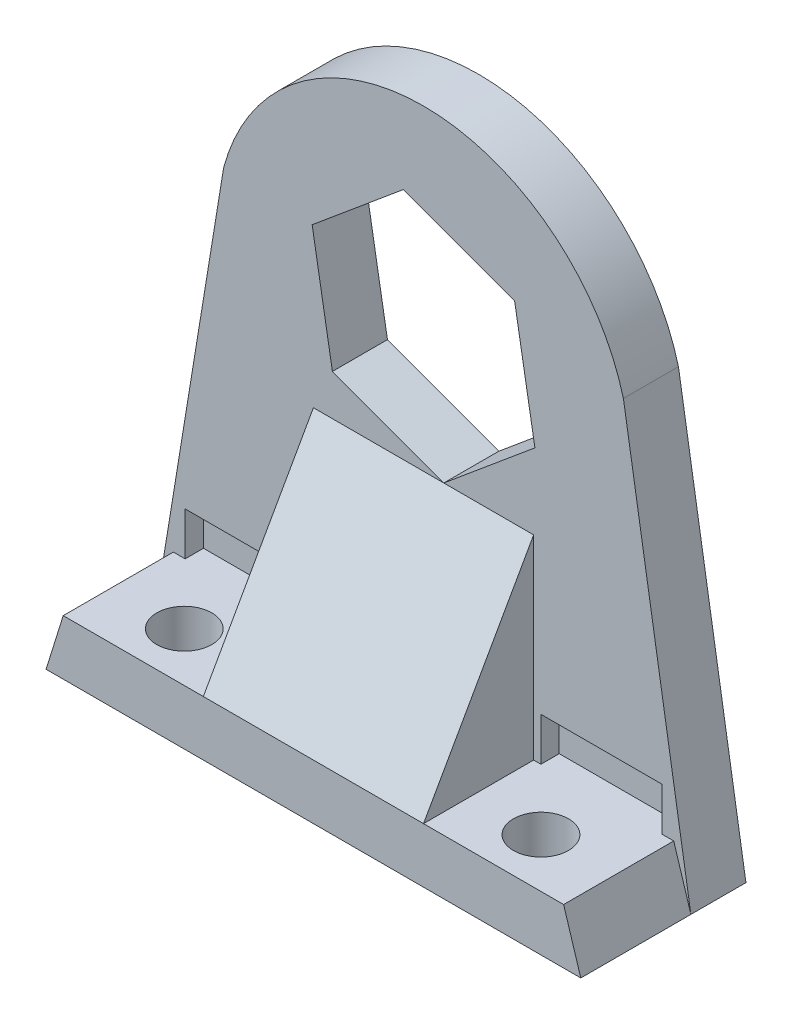
ISO-10303-21;
HEADER;
FILE_DESCRIPTION(('STEP AP214'),'2;1');
FILE_NAME('part.step','',(''),(''),'','','');
FILE_SCHEMA(('AUTOMOTIVE_DESIGN { 1 0 10303 214 1 1 1 1 }'));
ENDSEC;
DATA;
#1=APPLICATION_CONTEXT('core data for automotive mechanical design processes');
#2=APPLICATION_PROTOCOL_DEFINITION('international standard','automotive_design',2000,#1);
#3=PRODUCT_CONTEXT('',#1,'mechanical');
#4=PRODUCT('Part','Part','',(#3));
#5=PRODUCT_RELATED_PRODUCT_CATEGORY('part','',(#4));
#6=PRODUCT_DEFINITION_FORMATION('','',#4);
#7=PRODUCT_DEFINITION_CONTEXT('part definition',#1,'design');
#8=PRODUCT_DEFINITION('design','',#6,#7);
#9=PRODUCT_DEFINITION_SHAPE('','',#8);
#10=(LENGTH_UNIT() NAMED_UNIT(*) SI_UNIT(.MILLI.,.METRE.));
#11=(NAMED_UNIT(*) PLANE_ANGLE_UNIT() SI_UNIT($,.RADIAN.));
#12=(NAMED_UNIT(*) SI_UNIT($,.STERADIAN.) SOLID_ANGLE_UNIT());
#13=UNCERTAINTY_MEASURE_WITH_UNIT(LENGTH_MEASURE(1.E-05),#10,'distance_accuracy_value','');
#14=(GEOMETRIC_REPRESENTATION_CONTEXT(3) GLOBAL_UNCERTAINTY_ASSIGNED_CONTEXT((#13)) GLOBAL_UNIT_ASSIGNED_CONTEXT((#10,
#11,#12)) REPRESENTATION_CONTEXT('',''));
#15=CARTESIAN_POINT('',(0.,0.,0.));
#16=DIRECTION('',(0.,0.,1.));
#17=DIRECTION('',(1.,0.,0.));
#18=AXIS2_PLACEMENT_3D('',#15,#16,#17);
#19=CARTESIAN_POINT('',(0.,-8.15,9.));
#20=DIRECTION('',(0.,-1.,0.));
#21=DIRECTION('',(0.,0.,-1.));
#22=AXIS2_PLACEMENT_3D('',#19,#20,#21);
#23=PLANE('',#22);
#24=CARTESIAN_POINT('',(-9.71863902459822,-8.15,6.31932922540484));
#25=DIRECTION('',(0.,1.,0.));
#26=DIRECTION('',(0.,0.,1.));
#27=AXIS2_PLACEMENT_3D('',#24,#25,#26);
#28=CIRCLE('',#27,1.5);
#29=CARTESIAN_POINT('',(-9.71863902459822,-8.15,7.81932922540484));
#30=VERTEX_POINT('',#29);
#31=EDGE_CURVE('E373',#30,#30,#28,.T.);
#32=ORIENTED_EDGE('',*,*,#31,.F.);
#33=EDGE_LOOP('',(#32));
#34=FACE_BOUND('',#33,.T.);
#35=DIRECTION('',(0.,0.,-1.));
#36=VECTOR('',#35,1.);
#37=CARTESIAN_POINT('',(-6.,-8.15,3.));
#38=LINE('',#37,#36);
#39=CARTESIAN_POINT('',(-6.,-8.15,9.));
#40=VERTEX_POINT('',#39);
#41=CARTESIAN_POINT('',(-6.,-8.15,3.));
#42=VERTEX_POINT('',#41);
#43=EDGE_CURVE('E261',#40,#42,#38,.T.);
#44=ORIENTED_EDGE('',*,*,#43,.T.);
#45=DIRECTION('',(-1.,0.,0.));
#46=VECTOR('',#45,1.);
#47=CARTESIAN_POINT('',(0.,-8.15,3.));
#48=LINE('',#47,#46);
#49=CARTESIAN_POINT('',(-6.39519606206425,-8.15,3.));
#50=VERTEX_POINT('',#49);
#51=EDGE_CURVE('E396',#42,#50,#48,.T.);
#52=ORIENTED_EDGE('',*,*,#51,.T.);
#53=DIRECTION('',(0.,0.,1.));
#54=VECTOR('',#53,1.);
#55=CARTESIAN_POINT('',(-6.39519606206425,-8.15,2.));
#56=LINE('',#55,#54);
#57=CARTESIAN_POINT('',(-6.39519606206425,-8.15,2.));
#58=VERTEX_POINT('',#57);
#59=EDGE_CURVE('E264',#58,#50,#56,.T.);
#60=ORIENTED_EDGE('',*,*,#59,.F.);
#61=DIRECTION('',(1.,0.,0.));
#62=VECTOR('',#61,1.);
#63=CARTESIAN_POINT('',(-12.991498918533,-8.15,2.));
#64=LINE('',#63,#62);
#65=CARTESIAN_POINT('',(-12.991498918533,-8.15,2.));
#66=VERTEX_POINT('',#65);
#67=EDGE_CURVE('E242',#66,#58,#64,.T.);
#68=ORIENTED_EDGE('',*,*,#67,.F.);
#69=DIRECTION('',(0.,0.,1.));
#70=VECTOR('',#69,1.);
#71=CARTESIAN_POINT('',(-12.991498918533,-8.15,2.));
#72=LINE('',#71,#70);
#73=CARTESIAN_POINT('',(-12.991498918533,-8.15,3.));
#74=VERTEX_POINT('',#73);
#75=EDGE_CURVE('E252',#66,#74,#72,.T.);
#76=ORIENTED_EDGE('',*,*,#75,.T.);
#77=CARTESIAN_POINT('',(-13.6342789095463,-8.15,3.));
#78=VERTEX_POINT('',#77);
#79=EDGE_CURVE('E379',#74,#78,#48,.T.);
#80=ORIENTED_EDGE('',*,*,#79,.T.);
#81=DIRECTION('',(0.,0.,-1.));
#82=VECTOR('',#81,1.);
#83=CARTESIAN_POINT('',(-13.6342789095463,-8.15,9.));
#84=LINE('',#83,#82);
#85=CARTESIAN_POINT('',(-13.6342789095463,-8.15,9.));
#86=VERTEX_POINT('',#85);
#87=EDGE_CURVE('E398',#86,#78,#84,.T.);
#88=ORIENTED_EDGE('',*,*,#87,.F.);
#89=DIRECTION('',(-1.,0.,0.));
#90=VECTOR('',#89,1.);
#91=CARTESIAN_POINT('',(-13.6342789095463,-8.15,9.));
#92=LINE('',#91,#90);
#93=EDGE_CURVE('E384',#40,#86,#92,.T.);
#94=ORIENTED_EDGE('',*,*,#93,.F.);
#95=EDGE_LOOP('',(#44,#52,#60,#68,#76,#80,#88,#94));
#96=FACE_BOUND('',#95,.T.);
#97=ADVANCED_FACE('F38',(#34,#96),#23,.F.);
#98=CARTESIAN_POINT('',(-10.1101622731683,3.15237961251199,3.));
#99=DIRECTION('',(0.954669206131406,-0.297668787185406,0.));
#100=DIRECTION('',(0.297668787185406,0.954669206131406,0.));
#101=AXIS2_PLACEMENT_3D('',#98,#99,#100);
#102=PLANE('',#101);
#103=DIRECTION('',(0.297668787185406,0.954669206131406,0.));
#104=VECTOR('',#103,1.);
#105=CARTESIAN_POINT('',(-10.1101622731683,3.15237961251199,3.));
#106=LINE('',#105,#104);
#107=CARTESIAN_POINT('',(-14.5696881128817,-11.15,3.));
#108=VERTEX_POINT('',#107);
#109=EDGE_CURVE('E364',#108,#78,#106,.T.);
#110=ORIENTED_EDGE('',*,*,#109,.F.);
#111=DIRECTION('',(0.,0.,-1.));
#112=VECTOR('',#111,1.);
#113=CARTESIAN_POINT('',(-14.5696881128817,-11.15,3.));
#114=LINE('',#113,#112);
#115=CARTESIAN_POINT('',(-14.5696881128817,-11.15,9.));
#116=VERTEX_POINT('',#115);
#117=EDGE_CURVE('E11',#116,#108,#114,.T.);
#118=ORIENTED_EDGE('',*,*,#117,.F.);
#119=DIRECTION('',(-0.297668787185405,-0.954669206131407,0.));
#120=VECTOR('',#119,1.);
#121=CARTESIAN_POINT('',(-14.5696881128817,-11.15,9.));
#122=LINE('',#121,#120);
#123=EDGE_CURVE('E383',#86,#116,#122,.T.);
#124=ORIENTED_EDGE('',*,*,#123,.F.);
#125=ORIENTED_EDGE('',*,*,#87,.T.);
#126=EDGE_LOOP('',(#110,#118,#124,#125));
#127=FACE_BOUND('',#126,.T.);
#128=ADVANCED_FACE('F40',(#127),#102,.F.);
#129=CARTESIAN_POINT('',(10.1101622731683,3.152379612512,3.));
#130=DIRECTION('',(0.954669206131406,0.297668787185406,0.));
#131=DIRECTION('',(-0.297668787185406,0.954669206131406,0.));
#132=AXIS2_PLACEMENT_3D('',#129,#130,#131);
#133=PLANE('',#132);
#134=DIRECTION('',(0.,0.,-1.));
#135=VECTOR('',#134,1.);
#136=CARTESIAN_POINT('',(14.5696881128817,-11.15,3.));
#137=LINE('',#136,#135);
#138=CARTESIAN_POINT('',(14.5696881128817,-11.15,9.));
#139=VERTEX_POINT('',#138);
#140=CARTESIAN_POINT('',(14.5696881128817,-11.15,3.));
#141=VERTEX_POINT('',#140);
#142=EDGE_CURVE('E46',#139,#141,#137,.T.);
#143=ORIENTED_EDGE('',*,*,#142,.T.);
#144=DIRECTION('',(-0.297668787185406,0.954669206131406,0.));
#145=VECTOR('',#144,1.);
#146=CARTESIAN_POINT('',(10.1101622731683,3.152379612512,3.));
#147=LINE('',#146,#145);
#148=CARTESIAN_POINT('',(13.6342789095463,-8.15,3.));
#149=VERTEX_POINT('',#148);
#150=EDGE_CURVE('E357',#141,#149,#147,.T.);
#151=ORIENTED_EDGE('',*,*,#150,.T.);
#152=DIRECTION('',(0.,0.,-1.));
#153=VECTOR('',#152,1.);
#154=CARTESIAN_POINT('',(13.6342789095463,-8.15,9.));
#155=LINE('',#154,#153);
#156=CARTESIAN_POINT('',(13.6342789095463,-8.15,9.));
#157=VERTEX_POINT('',#156);
#158=EDGE_CURVE('E393',#157,#149,#155,.T.);
#159=ORIENTED_EDGE('',*,*,#158,.F.);
#160=DIRECTION('',(-0.297668787185406,0.954669206131406,0.));
#161=VECTOR('',#160,1.);
#162=CARTESIAN_POINT('',(13.6342789095463,-8.15,9.));
#163=LINE('',#162,#161);
#164=EDGE_CURVE('E390',#139,#157,#163,.T.);
#165=ORIENTED_EDGE('',*,*,#164,.F.);
#166=EDGE_LOOP('',(#143,#151,#159,#165));
#167=FACE_BOUND('',#166,.T.);
#168=ADVANCED_FACE('F406',(#167),#133,.T.);
#169=CARTESIAN_POINT('',(0.,-11.15,3.));
#170=DIRECTION('',(0.,1.,0.));
#171=DIRECTION('',(-1.,0.,0.));
#172=AXIS2_PLACEMENT_3D('',#169,#170,#171);
#173=PLANE('',#172);
#174=DIRECTION('',(0.,0.,-1.));
#175=VECTOR('',#174,1.);
#176=CARTESIAN_POINT('',(14.5696881128817,-11.15,3.));
#177=LINE('',#176,#175);
#178=CARTESIAN_POINT('',(14.5696881128817,-11.15,0.));
#179=VERTEX_POINT('',#178);
#180=EDGE_CURVE('E354',#141,#179,#177,.T.);
#181=ORIENTED_EDGE('',*,*,#180,.F.);
#182=ORIENTED_EDGE('',*,*,#142,.F.);
#183=DIRECTION('',(1.,0.,0.));
#184=VECTOR('',#183,1.);
#185=CARTESIAN_POINT('',(14.5696881128817,-11.15,9.));
#186=LINE('',#185,#184);
#187=EDGE_CURVE('E387',#116,#139,#186,.T.);
#188=ORIENTED_EDGE('',*,*,#187,.F.);
#189=ORIENTED_EDGE('',*,*,#117,.T.);
#190=DIRECTION('',(0.,0.,-1.));
#191=VECTOR('',#190,1.);
#192=CARTESIAN_POINT('',(-14.5696881128817,-11.15,3.));
#193=LINE('',#192,#191);
#194=CARTESIAN_POINT('',(-14.5696881128817,-11.15,0.));
#195=VERTEX_POINT('',#194);
#196=EDGE_CURVE('E346',#108,#195,#193,.T.);
#197=ORIENTED_EDGE('',*,*,#196,.T.);
#198=DIRECTION('',(1.,0.,0.));
#199=VECTOR('',#198,1.);
#200=CARTESIAN_POINT('',(0.,-11.15,0.));
#201=LINE('',#200,#199);
#202=EDGE_CURVE('E401',#195,#179,#201,.T.);
#203=ORIENTED_EDGE('',*,*,#202,.T.);
#204=EDGE_LOOP('',(#181,#182,#188,#189,#197,#203));
#205=FACE_BOUND('',#204,.T.);
#206=CARTESIAN_POINT('',(-9.71863902459822,-11.15,6.31932922540484));
#207=DIRECTION('',(0.,1.,0.));
#208=DIRECTION('',(-1.,0.,0.));
#209=AXIS2_PLACEMENT_3D('',#206,#207,#208);
#210=CIRCLE('',#209,1.5);
#211=CARTESIAN_POINT('',(-11.2186390245982,-11.15,6.31932922540484));
#212=VERTEX_POINT('',#211);
#213=EDGE_CURVE('E376',#212,#212,#210,.T.);
#214=ORIENTED_EDGE('',*,*,#213,.T.);
#215=EDGE_LOOP('',(#214));
#216=FACE_BOUND('',#215,.T.);
#217=CARTESIAN_POINT('',(9.71863902459822,-11.15,6.31932922540484));
#218=DIRECTION('',(0.,1.,0.));
#219=DIRECTION('',(-1.,0.,0.));
#220=AXIS2_PLACEMENT_3D('',#217,#218,#219);
#221=CIRCLE('',#220,1.5);
#222=CARTESIAN_POINT('',(8.21863902459822,-11.15,6.31932922540484));
#223=VERTEX_POINT('',#222);
#224=EDGE_CURVE('E370',#223,#223,#221,.T.);
#225=ORIENTED_EDGE('',*,*,#224,.T.);
#226=EDGE_LOOP('',(#225));
#227=FACE_BOUND('',#226,.T.);
#228=ADVANCED_FACE('F427',(#205,#216,#227),#173,.F.);
#229=CARTESIAN_POINT('',(0.,0.,3.));
#230=DIRECTION('',(0.,0.,1.));
#231=DIRECTION('',(1.,0.,0.));
#232=AXIS2_PLACEMENT_3D('',#229,#230,#231);
#233=PLANE('',#232);
#234=DIRECTION('',(0.,-1.,0.));
#235=VECTOR('',#234,1.);
#236=CARTESIAN_POINT('',(6.39519606206425,-8.15,3.));
#237=LINE('',#236,#235);
#238=CARTESIAN_POINT('',(6.39519606206425,-5.79113132266735,3.));
#239=VERTEX_POINT('',#238);
#240=CARTESIAN_POINT('',(6.39519606206425,-8.15,3.));
#241=VERTEX_POINT('',#240);
#242=EDGE_CURVE('E53',#239,#241,#237,.T.);
#243=ORIENTED_EDGE('',*,*,#242,.F.);
#244=DIRECTION('',(-1.,0.,0.));
#245=VECTOR('',#244,1.);
#246=CARTESIAN_POINT('',(12.991498918533,-5.79113132266735,3.));
#247=LINE('',#246,#245);
#248=CARTESIAN_POINT('',(12.991498918533,-5.79113132266735,3.));
#249=VERTEX_POINT('',#248);
#250=EDGE_CURVE('E225',#249,#239,#247,.T.);
#251=ORIENTED_EDGE('',*,*,#250,.F.);
#252=DIRECTION('',(0.,1.,0.));
#253=VECTOR('',#252,1.);
#254=CARTESIAN_POINT('',(12.991498918533,-8.15,3.));
#255=LINE('',#254,#253);
#256=CARTESIAN_POINT('',(12.991498918533,-8.15,3.));
#257=VERTEX_POINT('',#256);
#258=EDGE_CURVE('E230',#257,#249,#255,.T.);
#259=ORIENTED_EDGE('',*,*,#258,.F.);
#260=EDGE_CURVE('E207',#149,#257,#48,.T.);
#261=ORIENTED_EDGE('',*,*,#260,.F.);
#262=ORIENTED_EDGE('',*,*,#150,.F.);
#263=DIRECTION('',(-0.161194639212652,0.986922635412271,0.));
#264=VECTOR('',#263,1.);
#265=CARTESIAN_POINT('',(12.4172975219101,2.02812431513877,3.));
#266=LINE('',#265,#264);
#267=CARTESIAN_POINT('',(10.8926184348422,11.3630520156931,3.));
#268=VERTEX_POINT('',#267);
#269=EDGE_CURVE('E344',#141,#268,#266,.T.);
#270=ORIENTED_EDGE('',*,*,#269,.T.);
#271=CARTESIAN_POINT('',(0.,8.44085626281097,3.));
#272=DIRECTION('',(0.,0.,-1.));
#273=DIRECTION('',(-1.,0.,0.));
#274=AXIS2_PLACEMENT_3D('',#271,#272,#273);
#275=CIRCLE('',#274,11.2777818911889);
#276=CARTESIAN_POINT('',(-10.8926184348422,11.3630520156931,3.));
#277=VERTEX_POINT('',#276);
#278=EDGE_CURVE('E340',#277,#268,#275,.T.);
#279=ORIENTED_EDGE('',*,*,#278,.F.);
#280=DIRECTION('',(0.161194639212651,0.986922635412272,0.));
#281=VECTOR('',#280,1.);
#282=CARTESIAN_POINT('',(-12.4172975219102,2.02812431513876,3.));
#283=LINE('',#282,#281);
#284=EDGE_CURVE('E337',#108,#277,#283,.T.);
#285=ORIENTED_EDGE('',*,*,#284,.F.);
#286=ORIENTED_EDGE('',*,*,#109,.T.);
#287=ORIENTED_EDGE('',*,*,#79,.F.);
#288=DIRECTION('',(0.,-1.,0.));
#289=VECTOR('',#288,1.);
#290=CARTESIAN_POINT('',(-12.991498918533,-8.15,3.));
#291=LINE('',#290,#289);
#292=CARTESIAN_POINT('',(-12.991498918533,-5.79113132266735,3.));
#293=VERTEX_POINT('',#292);
#294=EDGE_CURVE('E61',#293,#74,#291,.T.);
#295=ORIENTED_EDGE('',*,*,#294,.F.);
#296=DIRECTION('',(-1.,0.,0.));
#297=VECTOR('',#296,1.);
#298=CARTESIAN_POINT('',(-12.991498918533,-5.79113132266735,3.));
#299=LINE('',#298,#297);
#300=CARTESIAN_POINT('',(-6.39519606206425,-5.79113132266735,3.));
#301=VERTEX_POINT('',#300);
#302=EDGE_CURVE('E243',#301,#293,#299,.T.);
#303=ORIENTED_EDGE('',*,*,#302,.F.);
#304=DIRECTION('',(0.,1.,0.));
#305=VECTOR('',#304,1.);
#306=CARTESIAN_POINT('',(-6.39519606206425,-8.15,3.));
#307=LINE('',#306,#305);
#308=EDGE_CURVE('E254',#50,#301,#307,.T.);
#309=ORIENTED_EDGE('',*,*,#308,.F.);
#310=ORIENTED_EDGE('',*,*,#51,.F.);
#311=DIRECTION('',(0.,1.,0.));
#312=VECTOR('',#311,1.);
#313=CARTESIAN_POINT('',(-6.,2.47853475664068,3.));
#314=LINE('',#313,#312);
#315=CARTESIAN_POINT('',(-6.,2.47853475664068,3.));
#316=VERTEX_POINT('',#315);
#317=EDGE_CURVE('E278',#42,#316,#314,.T.);
#318=ORIENTED_EDGE('',*,*,#317,.T.);
#319=DIRECTION('',(-1.,0.,0.));
#320=VECTOR('',#319,1.);
#321=CARTESIAN_POINT('',(6.,2.47853475664068,3.));
#322=LINE('',#321,#320);
#323=CARTESIAN_POINT('',(1.103523441526,2.47853475664068,3.));
#324=VERTEX_POINT('',#323);
#325=EDGE_CURVE('E285',#324,#316,#322,.T.);
#326=ORIENTED_EDGE('',*,*,#325,.F.);
#327=DIRECTION('',(-0.938649749917155,0.344871928374087,0.));
#328=VECTOR('',#327,1.);
#329=CARTESIAN_POINT('',(1.103523441526,2.47853475664068,3.));
#330=LINE('',#329,#328);
#331=CARTESIAN_POINT('',(-4.96608903931578,4.7085880442872,3.));
#332=VERTEX_POINT('',#331);
#333=EDGE_CURVE('E302',#324,#332,#330,.T.);
#334=ORIENTED_EDGE('',*,*,#333,.T.);
#335=DIRECTION('',(-0.17065702393449,0.985330492871211,0.));
#336=VECTOR('',#335,1.);
#337=CARTESIAN_POINT('',(-4.96608903931578,4.7085880442872,3.));
#338=LINE('',#337,#336);
#339=CARTESIAN_POINT('',(-6.06961248084178,11.0800532876465,3.));
#340=VERTEX_POINT('',#339);
#341=EDGE_CURVE('E305',#332,#340,#338,.T.);
#342=ORIENTED_EDGE('',*,*,#341,.T.);
#343=DIRECTION('',(0.767992725982665,0.640458564497123,0.));
#344=VECTOR('',#343,1.);
#345=CARTESIAN_POINT('',(-6.06961248084178,11.0800532876465,3.));
#346=LINE('',#345,#344);
#347=CARTESIAN_POINT('',(-1.103523441526,15.2214652433593,3.));
#348=VERTEX_POINT('',#347);
#349=EDGE_CURVE('E289',#340,#348,#346,.T.);
#350=ORIENTED_EDGE('',*,*,#349,.T.);
#351=DIRECTION('',(0.938649749917155,-0.344871928374087,0.));
#352=VECTOR('',#351,1.);
#353=CARTESIAN_POINT('',(-1.103523441526,15.2214652433593,3.));
#354=LINE('',#353,#352);
#355=CARTESIAN_POINT('',(4.96608903931578,12.9914119557128,3.));
#356=VERTEX_POINT('',#355);
#357=EDGE_CURVE('E292',#348,#356,#354,.T.);
#358=ORIENTED_EDGE('',*,*,#357,.T.);
#359=DIRECTION('',(0.17065702393449,-0.985330492871211,0.));
#360=VECTOR('',#359,1.);
#361=CARTESIAN_POINT('',(4.96608903931578,12.9914119557128,3.));
#362=LINE('',#361,#360);
#363=CARTESIAN_POINT('',(6.06961248084178,6.61994671235349,3.));
#364=VERTEX_POINT('',#363);
#365=EDGE_CURVE('E296',#356,#364,#362,.T.);
#366=ORIENTED_EDGE('',*,*,#365,.T.);
#367=DIRECTION('',(-0.767992725982665,-0.640458564497123,0.));
#368=VECTOR('',#367,1.);
#369=CARTESIAN_POINT('',(6.06961248084178,6.61994671235349,3.));
#370=LINE('',#369,#368);
#371=EDGE_CURVE('E299',#364,#324,#370,.T.);
#372=ORIENTED_EDGE('',*,*,#371,.T.);
#373=CARTESIAN_POINT('',(6.,2.47853475664068,3.));
#374=VERTEX_POINT('',#373);
#375=EDGE_CURVE('E286',#374,#324,#322,.T.);
#376=ORIENTED_EDGE('',*,*,#375,.F.);
#377=DIRECTION('',(0.,1.,0.));
#378=VECTOR('',#377,1.);
#379=CARTESIAN_POINT('',(6.,2.47853475664068,3.));
#380=LINE('',#379,#378);
#381=CARTESIAN_POINT('',(6.,-8.15,3.));
#382=VERTEX_POINT('',#381);
#383=EDGE_CURVE('E270',#382,#374,#380,.T.);
#384=ORIENTED_EDGE('',*,*,#383,.F.);
#385=EDGE_CURVE('E395',#241,#382,#48,.T.);
#386=ORIENTED_EDGE('',*,*,#385,.F.);
#387=EDGE_LOOP('',(#243,#251,#259,#261,#262,#270,#279,#285,#286,#287,#295,#303,#309,#310,#318,
#326,#334,#342,#350,#358,#366,#372,#376,#384,#386));
#388=FACE_BOUND('',#387,.T.);
#389=ADVANCED_FACE('F412',(#388),#233,.T.);
#390=CARTESIAN_POINT('',(0.,0.,0.));
#391=DIRECTION('',(0.,0.,1.));
#392=DIRECTION('',(1.,0.,0.));
#393=AXIS2_PLACEMENT_3D('',#390,#391,#392);
#394=PLANE('',#393);
#395=DIRECTION('',(0.938649749917155,-0.344871928374087,0.));
#396=VECTOR('',#395,1.);
#397=CARTESIAN_POINT('',(-1.103523441526,15.2214652433593,0.));
#398=LINE('',#397,#396);
#399=CARTESIAN_POINT('',(-1.103523441526,15.2214652433593,0.));
#400=VERTEX_POINT('',#399);
#401=CARTESIAN_POINT('',(4.96608903931578,12.9914119557128,0.));
#402=VERTEX_POINT('',#401);
#403=EDGE_CURVE('E310',#400,#402,#398,.T.);
#404=ORIENTED_EDGE('',*,*,#403,.F.);
#405=DIRECTION('',(0.767992725982665,0.640458564497123,0.));
#406=VECTOR('',#405,1.);
#407=CARTESIAN_POINT('',(-6.06961248084178,11.0800532876465,0.));
#408=LINE('',#407,#406);
#409=CARTESIAN_POINT('',(-6.06961248084178,11.0800532876465,0.));
#410=VERTEX_POINT('',#409);
#411=EDGE_CURVE('E288',#410,#400,#408,.T.);
#412=ORIENTED_EDGE('',*,*,#411,.F.);
#413=DIRECTION('',(-0.17065702393449,0.985330492871211,0.));
#414=VECTOR('',#413,1.);
#415=CARTESIAN_POINT('',(-4.96608903931578,4.7085880442872,0.));
#416=LINE('',#415,#414);
#417=CARTESIAN_POINT('',(-4.96608903931578,4.7085880442872,0.));
#418=VERTEX_POINT('',#417);
#419=EDGE_CURVE('E293',#418,#410,#416,.T.);
#420=ORIENTED_EDGE('',*,*,#419,.F.);
#421=DIRECTION('',(-0.938649749917155,0.344871928374087,0.));
#422=VECTOR('',#421,1.);
#423=CARTESIAN_POINT('',(1.103523441526,2.47853475664068,0.));
#424=LINE('',#423,#422);
#425=CARTESIAN_POINT('',(1.103523441526,2.47853475664068,0.));
#426=VERTEX_POINT('',#425);
#427=EDGE_CURVE('E319',#426,#418,#424,.T.);
#428=ORIENTED_EDGE('',*,*,#427,.F.);
#429=DIRECTION('',(-0.767992725982665,-0.640458564497123,0.));
#430=VECTOR('',#429,1.);
#431=CARTESIAN_POINT('',(6.06961248084178,6.61994671235349,0.));
#432=LINE('',#431,#430);
#433=CARTESIAN_POINT('',(6.06961248084178,6.61994671235349,0.));
#434=VERTEX_POINT('',#433);
#435=EDGE_CURVE('E316',#434,#426,#432,.T.);
#436=ORIENTED_EDGE('',*,*,#435,.F.);
#437=DIRECTION('',(0.17065702393449,-0.985330492871211,0.));
#438=VECTOR('',#437,1.);
#439=CARTESIAN_POINT('',(4.96608903931578,12.9914119557128,0.));
#440=LINE('',#439,#438);
#441=EDGE_CURVE('E313',#402,#434,#440,.T.);
#442=ORIENTED_EDGE('',*,*,#441,.F.);
#443=EDGE_LOOP('',(#404,#412,#420,#428,#436,#442));
#444=FACE_BOUND('',#443,.T.);
#445=ORIENTED_EDGE('',*,*,#202,.F.);
#446=DIRECTION('',(0.161194639212651,0.986922635412272,0.));
#447=VECTOR('',#446,1.);
#448=CARTESIAN_POINT('',(-12.4172975219102,2.02812431513876,0.));
#449=LINE('',#448,#447);
#450=CARTESIAN_POINT('',(-10.8926184348422,11.3630520156931,0.));
#451=VERTEX_POINT('',#450);
#452=EDGE_CURVE('E326',#195,#451,#449,.T.);
#453=ORIENTED_EDGE('',*,*,#452,.T.);
#454=CARTESIAN_POINT('',(0.,8.44085626281097,0.));
#455=DIRECTION('',(0.,0.,-1.));
#456=DIRECTION('',(-1.,0.,0.));
#457=AXIS2_PLACEMENT_3D('',#454,#455,#456);
#458=CIRCLE('',#457,11.2777818911889);
#459=CARTESIAN_POINT('',(10.8926184348422,11.3630520156931,0.));
#460=VERTEX_POINT('',#459);
#461=EDGE_CURVE('E349',#451,#460,#458,.T.);
#462=ORIENTED_EDGE('',*,*,#461,.T.);
#463=DIRECTION('',(-0.161194639212652,0.986922635412271,0.));
#464=VECTOR('',#463,1.);
#465=CARTESIAN_POINT('',(12.4172975219101,2.02812431513877,0.));
#466=LINE('',#465,#464);
#467=EDGE_CURVE('E341',#179,#460,#466,.T.);
#468=ORIENTED_EDGE('',*,*,#467,.F.);
#469=EDGE_LOOP('',(#445,#453,#462,#468));
#470=FACE_BOUND('',#469,.T.);
#471=ADVANCED_FACE('F430',(#444,#470),#394,.F.);
#472=CARTESIAN_POINT('',(9.71863902459822,-8.15,6.31932922540484));
#473=DIRECTION('',(0.,1.,0.));
#474=DIRECTION('',(0.,0.,-1.));
#475=AXIS2_PLACEMENT_3D('',#472,#473,#474);
#476=CIRCLE('',#475,1.5);
#477=CARTESIAN_POINT('',(9.71863902459822,-8.15,4.81932922540484));
#478=VERTEX_POINT('',#477);
#479=EDGE_CURVE('E367',#478,#478,#476,.T.);
#480=ORIENTED_EDGE('',*,*,#479,.F.);
#481=EDGE_LOOP('',(#480));
#482=FACE_BOUND('',#481,.T.);
#483=ORIENTED_EDGE('',*,*,#260,.T.);
#484=DIRECTION('',(0.,0.,1.));
#485=VECTOR('',#484,1.);
#486=CARTESIAN_POINT('',(12.991498918533,-8.15,2.));
#487=LINE('',#486,#485);
#488=CARTESIAN_POINT('',(12.991498918533,-8.15,2.));
#489=VERTEX_POINT('',#488);
#490=EDGE_CURVE('E199',#489,#257,#487,.T.);
#491=ORIENTED_EDGE('',*,*,#490,.F.);
#492=DIRECTION('',(1.,0.,0.));
#493=VECTOR('',#492,1.);
#494=CARTESIAN_POINT('',(12.991498918533,-8.15,2.));
#495=LINE('',#494,#493);
#496=CARTESIAN_POINT('',(6.39519606206425,-8.15,2.));
#497=VERTEX_POINT('',#496);
#498=EDGE_CURVE('E203',#497,#489,#495,.T.);
#499=ORIENTED_EDGE('',*,*,#498,.F.);
#500=DIRECTION('',(0.,0.,1.));
#501=VECTOR('',#500,1.);
#502=CARTESIAN_POINT('',(6.39519606206425,-8.15,2.));
#503=LINE('',#502,#501);
#504=EDGE_CURVE('E234',#497,#241,#503,.T.);
#505=ORIENTED_EDGE('',*,*,#504,.T.);
#506=ORIENTED_EDGE('',*,*,#385,.T.);
#507=DIRECTION('',(0.,0.,-1.));
#508=VECTOR('',#507,1.);
#509=CARTESIAN_POINT('',(6.,-8.15,3.));
#510=LINE('',#509,#508);
#511=CARTESIAN_POINT('',(6.,-8.15,9.));
#512=VERTEX_POINT('',#511);
#513=EDGE_CURVE('E267',#512,#382,#510,.T.);
#514=ORIENTED_EDGE('',*,*,#513,.F.);
#515=EDGE_CURVE('E380',#157,#512,#92,.T.);
#516=ORIENTED_EDGE('',*,*,#515,.F.);
#517=ORIENTED_EDGE('',*,*,#158,.T.);
#518=EDGE_LOOP('',(#483,#491,#499,#505,#506,#514,#516,#517));
#519=FACE_BOUND('',#518,.T.);
#520=ADVANCED_FACE('F201',(#482,#519),#23,.F.);
#521=CARTESIAN_POINT('',(0.,0.,9.));
#522=DIRECTION('',(0.,0.,-1.));
#523=DIRECTION('',(-1.,0.,0.));
#524=AXIS2_PLACEMENT_3D('',#521,#522,#523);
#525=PLANE('',#524);
#526=ORIENTED_EDGE('',*,*,#515,.T.);
#527=DIRECTION('',(-1.,0.,0.));
#528=VECTOR('',#527,1.);
#529=CARTESIAN_POINT('',(6.,-8.15,9.));
#530=LINE('',#529,#528);
#531=EDGE_CURVE('E275',#512,#40,#530,.T.);
#532=ORIENTED_EDGE('',*,*,#531,.T.);
#533=ORIENTED_EDGE('',*,*,#93,.T.);
#534=ORIENTED_EDGE('',*,*,#123,.T.);
#535=ORIENTED_EDGE('',*,*,#187,.T.);
#536=ORIENTED_EDGE('',*,*,#164,.T.);
#537=EDGE_LOOP('',(#526,#532,#533,#534,#535,#536));
#538=FACE_BOUND('',#537,.T.);
#539=ADVANCED_FACE('F438',(#538),#525,.F.);
#540=CARTESIAN_POINT('',(-9.71863902459822,-14.15,6.31932922540484));
#541=DIRECTION('',(0.,1.,0.));
#542=DIRECTION('',(0.,0.,1.));
#543=AXIS2_PLACEMENT_3D('',#540,#541,#542);
#544=CYLINDRICAL_SURFACE('',#543,1.5);
#545=ORIENTED_EDGE('',*,*,#31,.T.);
#546=EDGE_LOOP('',(#545));
#547=FACE_BOUND('',#546,.T.);
#548=ORIENTED_EDGE('',*,*,#213,.F.);
#549=EDGE_LOOP('',(#548));
#550=FACE_BOUND('',#549,.T.);
#551=ADVANCED_FACE('F455',(#547,#550),#544,.F.);
#552=CARTESIAN_POINT('',(9.71863902459822,-14.15,6.31932922540484));
#553=DIRECTION('',(0.,1.,0.));
#554=DIRECTION('',(0.,0.,1.));
#555=AXIS2_PLACEMENT_3D('',#552,#553,#554);
#556=CYLINDRICAL_SURFACE('',#555,1.5);
#557=ORIENTED_EDGE('',*,*,#479,.T.);
#558=EDGE_LOOP('',(#557));
#559=FACE_BOUND('',#558,.T.);
#560=ORIENTED_EDGE('',*,*,#224,.F.);
#561=EDGE_LOOP('',(#560));
#562=FACE_BOUND('',#561,.T.);
#563=ADVANCED_FACE('F459',(#559,#562),#556,.F.);
#564=CARTESIAN_POINT('',(12.4172975219101,2.02812431513877,3.));
#565=DIRECTION('',(-0.986922635412271,-0.161194639212652,0.));
#566=DIRECTION('',(0.161194639212652,-0.986922635412271,0.));
#567=AXIS2_PLACEMENT_3D('',#564,#565,#566);
#568=PLANE('',#567);
#569=ORIENTED_EDGE('',*,*,#467,.T.);
#570=DIRECTION('',(0.,0.,-1.));
#571=VECTOR('',#570,1.);
#572=CARTESIAN_POINT('',(10.8926184348422,11.3630520156931,3.));
#573=LINE('',#572,#571);
#574=EDGE_CURVE('E358',#268,#460,#573,.T.);
#575=ORIENTED_EDGE('',*,*,#574,.F.);
#576=ORIENTED_EDGE('',*,*,#269,.F.);
#577=ORIENTED_EDGE('',*,*,#180,.T.);
#578=EDGE_LOOP('',(#569,#575,#576,#577));
#579=FACE_BOUND('',#578,.T.);
#580=ADVANCED_FACE('F416',(#579),#568,.F.);
#581=CARTESIAN_POINT('',(0.,8.44085626281097,3.));
#582=DIRECTION('',(0.,0.,-1.));
#583=DIRECTION('',(-1.,0.,0.));
#584=AXIS2_PLACEMENT_3D('',#581,#582,#583);
#585=CYLINDRICAL_SURFACE('',#584,11.2777818911889);
#586=ORIENTED_EDGE('',*,*,#461,.F.);
#587=DIRECTION('',(0.,0.,-1.));
#588=VECTOR('',#587,1.);
#589=CARTESIAN_POINT('',(-10.8926184348422,11.3630520156931,3.));
#590=LINE('',#589,#588);
#591=EDGE_CURVE('E360',#277,#451,#590,.T.);
#592=ORIENTED_EDGE('',*,*,#591,.F.);
#593=ORIENTED_EDGE('',*,*,#278,.T.);
#594=ORIENTED_EDGE('',*,*,#574,.T.);
#595=EDGE_LOOP('',(#586,#592,#593,#594));
#596=FACE_BOUND('',#595,.T.);
#597=ADVANCED_FACE('F420',(#596),#585,.T.);
#598=CARTESIAN_POINT('',(-12.4172975219102,2.02812431513876,3.));
#599=DIRECTION('',(-0.986922635412271,0.161194639212651,0.));
#600=DIRECTION('',(-0.161194639212651,-0.986922635412272,0.));
#601=AXIS2_PLACEMENT_3D('',#598,#599,#600);
#602=PLANE('',#601);
#603=ORIENTED_EDGE('',*,*,#452,.F.);
#604=ORIENTED_EDGE('',*,*,#196,.F.);
#605=ORIENTED_EDGE('',*,*,#284,.T.);
#606=ORIENTED_EDGE('',*,*,#591,.T.);
#607=EDGE_LOOP('',(#603,#604,#605,#606));
#608=FACE_BOUND('',#607,.T.);
#609=ADVANCED_FACE('F425',(#608),#602,.T.);
#610=CARTESIAN_POINT('',(-6.06961248084178,11.0800532876465,3.));
#611=DIRECTION('',(-0.640458564497123,0.767992725982665,0.));
#612=DIRECTION('',(-0.767992725982665,-0.640458564497123,0.));
#613=AXIS2_PLACEMENT_3D('',#610,#611,#612);
#614=PLANE('',#613);
#615=ORIENTED_EDGE('',*,*,#411,.T.);
#616=DIRECTION('',(0.,0.,-1.));
#617=VECTOR('',#616,1.);
#618=CARTESIAN_POINT('',(-1.103523441526,15.2214652433593,3.));
#619=LINE('',#618,#617);
#620=EDGE_CURVE('E308',#348,#400,#619,.T.);
#621=ORIENTED_EDGE('',*,*,#620,.F.);
#622=ORIENTED_EDGE('',*,*,#349,.F.);
#623=DIRECTION('',(0.,0.,-1.));
#624=VECTOR('',#623,1.);
#625=CARTESIAN_POINT('',(-6.06961248084178,11.0800532876465,3.));
#626=LINE('',#625,#624);
#627=EDGE_CURVE('E324',#340,#410,#626,.T.);
#628=ORIENTED_EDGE('',*,*,#627,.T.);
#629=EDGE_LOOP('',(#615,#621,#622,#628));
#630=FACE_BOUND('',#629,.T.);
#631=ADVANCED_FACE('F466',(#630),#614,.F.);
#632=CARTESIAN_POINT('',(-4.96608903931578,4.7085880442872,3.));
#633=DIRECTION('',(-0.985330492871211,-0.17065702393449,0.));
#634=DIRECTION('',(0.17065702393449,-0.985330492871211,0.));
#635=AXIS2_PLACEMENT_3D('',#632,#633,#634);
#636=PLANE('',#635);
#637=ORIENTED_EDGE('',*,*,#419,.T.);
#638=ORIENTED_EDGE('',*,*,#627,.F.);
#639=ORIENTED_EDGE('',*,*,#341,.F.);
#640=DIRECTION('',(0.,0.,-1.));
#641=VECTOR('',#640,1.);
#642=CARTESIAN_POINT('',(-4.96608903931578,4.7085880442872,3.));
#643=LINE('',#642,#641);
#644=EDGE_CURVE('E327',#332,#418,#643,.T.);
#645=ORIENTED_EDGE('',*,*,#644,.T.);
#646=EDGE_LOOP('',(#637,#638,#639,#645));
#647=FACE_BOUND('',#646,.T.);
#648=ADVANCED_FACE('F473',(#647),#636,.F.);
#649=CARTESIAN_POINT('',(1.103523441526,2.47853475664068,3.));
#650=DIRECTION('',(-0.344871928374087,-0.938649749917155,0.));
#651=DIRECTION('',(0.938649749917155,-0.344871928374087,0.));
#652=AXIS2_PLACEMENT_3D('',#649,#650,#651);
#653=PLANE('',#652);
#654=ORIENTED_EDGE('',*,*,#427,.T.);
#655=ORIENTED_EDGE('',*,*,#644,.F.);
#656=ORIENTED_EDGE('',*,*,#333,.F.);
#657=DIRECTION('',(0.,0.,-1.));
#658=VECTOR('',#657,1.);
#659=CARTESIAN_POINT('',(1.103523441526,2.47853475664068,3.));
#660=LINE('',#659,#658);
#661=EDGE_CURVE('E329',#324,#426,#660,.T.);
#662=ORIENTED_EDGE('',*,*,#661,.T.);
#663=EDGE_LOOP('',(#654,#655,#656,#662));
#664=FACE_BOUND('',#663,.T.);
#665=ADVANCED_FACE('F487',(#664),#653,.F.);
#666=CARTESIAN_POINT('',(6.06961248084178,6.61994671235349,3.));
#667=DIRECTION('',(0.640458564497123,-0.767992725982665,0.));
#668=DIRECTION('',(0.767992725982665,0.640458564497123,0.));
#669=AXIS2_PLACEMENT_3D('',#666,#667,#668);
#670=PLANE('',#669);
#671=ORIENTED_EDGE('',*,*,#435,.T.);
#672=ORIENTED_EDGE('',*,*,#661,.F.);
#673=ORIENTED_EDGE('',*,*,#371,.F.);
#674=DIRECTION('',(0.,0.,-1.));
#675=VECTOR('',#674,1.);
#676=CARTESIAN_POINT('',(6.06961248084178,6.61994671235349,3.));
#677=LINE('',#676,#675);
#678=EDGE_CURVE('E331',#364,#434,#677,.T.);
#679=ORIENTED_EDGE('',*,*,#678,.T.);
#680=EDGE_LOOP('',(#671,#672,#673,#679));
#681=FACE_BOUND('',#680,.T.);
#682=ADVANCED_FACE('F483',(#681),#670,.F.);
#683=CARTESIAN_POINT('',(4.96608903931578,12.9914119557128,3.));
#684=DIRECTION('',(0.985330492871211,0.17065702393449,0.));
#685=DIRECTION('',(-0.17065702393449,0.985330492871211,0.));
#686=AXIS2_PLACEMENT_3D('',#683,#684,#685);
#687=PLANE('',#686);
#688=ORIENTED_EDGE('',*,*,#441,.T.);
#689=ORIENTED_EDGE('',*,*,#678,.F.);
#690=ORIENTED_EDGE('',*,*,#365,.F.);
#691=DIRECTION('',(0.,0.,-1.));
#692=VECTOR('',#691,1.);
#693=CARTESIAN_POINT('',(4.96608903931578,12.9914119557128,3.));
#694=LINE('',#693,#692);
#695=EDGE_CURVE('E333',#356,#402,#694,.T.);
#696=ORIENTED_EDGE('',*,*,#695,.T.);
#697=EDGE_LOOP('',(#688,#689,#690,#696));
#698=FACE_BOUND('',#697,.T.);
#699=ADVANCED_FACE('F479',(#698),#687,.F.);
#700=CARTESIAN_POINT('',(-1.103523441526,15.2214652433593,3.));
#701=DIRECTION('',(0.344871928374087,0.938649749917156,0.));
#702=DIRECTION('',(-0.938649749917156,0.344871928374087,0.));
#703=AXIS2_PLACEMENT_3D('',#700,#701,#702);
#704=PLANE('',#703);
#705=ORIENTED_EDGE('',*,*,#403,.T.);
#706=ORIENTED_EDGE('',*,*,#695,.F.);
#707=ORIENTED_EDGE('',*,*,#357,.F.);
#708=ORIENTED_EDGE('',*,*,#620,.T.);
#709=EDGE_LOOP('',(#705,#706,#707,#708));
#710=FACE_BOUND('',#709,.T.);
#711=ADVANCED_FACE('F475',(#710),#704,.F.);
#712=CARTESIAN_POINT('',(6.,-8.15,9.));
#713=DIRECTION('',(0.,-0.491595654295454,-0.870823582982124));
#714=DIRECTION('',(0.,0.870823582982124,-0.491595654295454));
#715=AXIS2_PLACEMENT_3D('',#712,#713,#714);
#716=PLANE('',#715);
#717=DIRECTION('',(0.,-0.870823582982124,0.491595654295454));
#718=VECTOR('',#717,1.);
#719=CARTESIAN_POINT('',(-6.,-8.15,9.));
#720=LINE('',#719,#718);
#721=EDGE_CURVE('E271',#316,#40,#720,.T.);
#722=ORIENTED_EDGE('',*,*,#721,.T.);
#723=ORIENTED_EDGE('',*,*,#531,.F.);
#724=DIRECTION('',(0.,-0.870823582982124,0.491595654295454));
#725=VECTOR('',#724,1.);
#726=CARTESIAN_POINT('',(6.,-8.15,9.));
#727=LINE('',#726,#725);
#728=EDGE_CURVE('E273',#374,#512,#727,.T.);
#729=ORIENTED_EDGE('',*,*,#728,.F.);
#730=ORIENTED_EDGE('',*,*,#375,.T.);
#731=ORIENTED_EDGE('',*,*,#325,.T.);
#732=EDGE_LOOP('',(#722,#723,#729,#730,#731));
#733=FACE_BOUND('',#732,.T.);
#734=ADVANCED_FACE('F478',(#733),#716,.F.);
#735=CARTESIAN_POINT('',(6.,0.,0.));
#736=DIRECTION('',(1.,0.,0.));
#737=DIRECTION('',(0.,0.,-1.));
#738=AXIS2_PLACEMENT_3D('',#735,#736,#737);
#739=PLANE('',#738);
#740=ORIENTED_EDGE('',*,*,#513,.T.);
#741=ORIENTED_EDGE('',*,*,#383,.T.);
#742=ORIENTED_EDGE('',*,*,#728,.T.);
#743=EDGE_LOOP('',(#740,#741,#742));
#744=FACE_BOUND('',#743,.T.);
#745=ADVANCED_FACE('F497',(#744),#739,.T.);
#746=CARTESIAN_POINT('',(-6.,0.,0.));
#747=DIRECTION('',(1.,0.,0.));
#748=DIRECTION('',(0.,0.,-1.));
#749=AXIS2_PLACEMENT_3D('',#746,#747,#748);
#750=PLANE('',#749);
#751=ORIENTED_EDGE('',*,*,#43,.F.);
#752=ORIENTED_EDGE('',*,*,#721,.F.);
#753=ORIENTED_EDGE('',*,*,#317,.F.);
#754=EDGE_LOOP('',(#751,#752,#753));
#755=FACE_BOUND('',#754,.T.);
#756=ADVANCED_FACE('F499',(#755),#750,.F.);
#757=CARTESIAN_POINT('',(-12.991498918533,-8.15,2.));
#758=DIRECTION('',(-1.,0.,0.));
#759=DIRECTION('',(0.,0.,1.));
#760=AXIS2_PLACEMENT_3D('',#757,#758,#759);
#761=PLANE('',#760);
#762=ORIENTED_EDGE('',*,*,#294,.T.);
#763=ORIENTED_EDGE('',*,*,#75,.F.);
#764=DIRECTION('',(0.,-1.,0.));
#765=VECTOR('',#764,1.);
#766=CARTESIAN_POINT('',(-12.991498918533,-8.15,2.));
#767=LINE('',#766,#765);
#768=CARTESIAN_POINT('',(-12.991498918533,-5.79113132266735,2.));
#769=VERTEX_POINT('',#768);
#770=EDGE_CURVE('E239',#769,#66,#767,.T.);
#771=ORIENTED_EDGE('',*,*,#770,.F.);
#772=DIRECTION('',(0.,0.,1.));
#773=VECTOR('',#772,1.);
#774=CARTESIAN_POINT('',(-12.991498918533,-5.79113132266735,2.));
#775=LINE('',#774,#773);
#776=EDGE_CURVE('E259',#769,#293,#775,.T.);
#777=ORIENTED_EDGE('',*,*,#776,.T.);
#778=EDGE_LOOP('',(#762,#763,#771,#777));
#779=FACE_BOUND('',#778,.T.);
#780=ADVANCED_FACE('F502',(#779),#761,.F.);
#781=CARTESIAN_POINT('',(-12.991498918533,-5.79113132266735,2.));
#782=DIRECTION('',(0.,1.,0.));
#783=DIRECTION('',(0.,0.,1.));
#784=AXIS2_PLACEMENT_3D('',#781,#782,#783);
#785=PLANE('',#784);
#786=ORIENTED_EDGE('',*,*,#302,.T.);
#787=ORIENTED_EDGE('',*,*,#776,.F.);
#788=DIRECTION('',(-1.,0.,0.));
#789=VECTOR('',#788,1.);
#790=CARTESIAN_POINT('',(-12.991498918533,-5.79113132266735,2.));
#791=LINE('',#790,#789);
#792=CARTESIAN_POINT('',(-6.39519606206425,-5.79113132266735,2.));
#793=VERTEX_POINT('',#792);
#794=EDGE_CURVE('E249',#793,#769,#791,.T.);
#795=ORIENTED_EDGE('',*,*,#794,.F.);
#796=DIRECTION('',(0.,0.,1.));
#797=VECTOR('',#796,1.);
#798=CARTESIAN_POINT('',(-6.39519606206425,-5.79113132266735,2.));
#799=LINE('',#798,#797);
#800=EDGE_CURVE('E262',#793,#301,#799,.T.);
#801=ORIENTED_EDGE('',*,*,#800,.T.);
#802=EDGE_LOOP('',(#786,#787,#795,#801));
#803=FACE_BOUND('',#802,.T.);
#804=ADVANCED_FACE('F509',(#803),#785,.F.);
#805=CARTESIAN_POINT('',(-6.39519606206425,-8.15,2.));
#806=DIRECTION('',(1.,0.,0.));
#807=DIRECTION('',(0.,0.,-1.));
#808=AXIS2_PLACEMENT_3D('',#805,#806,#807);
#809=PLANE('',#808);
#810=ORIENTED_EDGE('',*,*,#308,.T.);
#811=ORIENTED_EDGE('',*,*,#800,.F.);
#812=DIRECTION('',(0.,1.,0.));
#813=VECTOR('',#812,1.);
#814=CARTESIAN_POINT('',(-6.39519606206425,-8.15,2.));
#815=LINE('',#814,#813);
#816=EDGE_CURVE('E246',#58,#793,#815,.T.);
#817=ORIENTED_EDGE('',*,*,#816,.F.);
#818=ORIENTED_EDGE('',*,*,#59,.T.);
#819=EDGE_LOOP('',(#810,#811,#817,#818));
#820=FACE_BOUND('',#819,.T.);
#821=ADVANCED_FACE('F510',(#820),#809,.F.);
#822=CARTESIAN_POINT('',(0.,0.,2.));
#823=DIRECTION('',(0.,0.,-1.));
#824=DIRECTION('',(-1.,0.,0.));
#825=AXIS2_PLACEMENT_3D('',#822,#823,#824);
#826=PLANE('',#825);
#827=ORIENTED_EDGE('',*,*,#770,.T.);
#828=ORIENTED_EDGE('',*,*,#67,.T.);
#829=ORIENTED_EDGE('',*,*,#816,.T.);
#830=ORIENTED_EDGE('',*,*,#794,.T.);
#831=EDGE_LOOP('',(#827,#828,#829,#830));
#832=FACE_BOUND('',#831,.T.);
#833=ADVANCED_FACE('F513',(#832),#826,.F.);
#834=CARTESIAN_POINT('',(6.39519606206425,-8.15,2.));
#835=DIRECTION('',(-1.,0.,0.));
#836=DIRECTION('',(0.,0.,1.));
#837=AXIS2_PLACEMENT_3D('',#834,#835,#836);
#838=PLANE('',#837);
#839=ORIENTED_EDGE('',*,*,#242,.T.);
#840=ORIENTED_EDGE('',*,*,#504,.F.);
#841=DIRECTION('',(0.,-1.,0.));
#842=VECTOR('',#841,1.);
#843=CARTESIAN_POINT('',(6.39519606206425,-8.15,2.));
#844=LINE('',#843,#842);
#845=CARTESIAN_POINT('',(6.39519606206425,-5.79113132266735,2.));
#846=VERTEX_POINT('',#845);
#847=EDGE_CURVE('E212',#846,#497,#844,.T.);
#848=ORIENTED_EDGE('',*,*,#847,.F.);
#849=DIRECTION('',(0.,0.,1.));
#850=VECTOR('',#849,1.);
#851=CARTESIAN_POINT('',(6.39519606206425,-5.79113132266735,2.));
#852=LINE('',#851,#850);
#853=EDGE_CURVE('E236',#846,#239,#852,.T.);
#854=ORIENTED_EDGE('',*,*,#853,.T.);
#855=EDGE_LOOP('',(#839,#840,#848,#854));
#856=FACE_BOUND('',#855,.T.);
#857=ADVANCED_FACE('F520',(#856),#838,.F.);
#858=CARTESIAN_POINT('',(12.991498918533,-5.79113132266735,2.));
#859=DIRECTION('',(0.,1.,0.));
#860=DIRECTION('',(0.,0.,1.));
#861=AXIS2_PLACEMENT_3D('',#858,#859,#860);
#862=PLANE('',#861);
#863=ORIENTED_EDGE('',*,*,#250,.T.);
#864=ORIENTED_EDGE('',*,*,#853,.F.);
#865=DIRECTION('',(-1.,0.,0.));
#866=VECTOR('',#865,1.);
#867=CARTESIAN_POINT('',(12.991498918533,-5.79113132266735,2.));
#868=LINE('',#867,#866);
#869=CARTESIAN_POINT('',(12.991498918533,-5.79113132266735,2.));
#870=VERTEX_POINT('',#869);
#871=EDGE_CURVE('E220',#870,#846,#868,.T.);
#872=ORIENTED_EDGE('',*,*,#871,.F.);
#873=DIRECTION('',(0.,0.,1.));
#874=VECTOR('',#873,1.);
#875=CARTESIAN_POINT('',(12.991498918533,-5.79113132266735,2.));
#876=LINE('',#875,#874);
#877=EDGE_CURVE('E211',#870,#249,#876,.T.);
#878=ORIENTED_EDGE('',*,*,#877,.T.);
#879=EDGE_LOOP('',(#863,#864,#872,#878));
#880=FACE_BOUND('',#879,.T.);
#881=ADVANCED_FACE('F524',(#880),#862,.F.);
#882=CARTESIAN_POINT('',(12.991498918533,-8.15,2.));
#883=DIRECTION('',(1.,0.,0.));
#884=DIRECTION('',(0.,0.,-1.));
#885=AXIS2_PLACEMENT_3D('',#882,#883,#884);
#886=PLANE('',#885);
#887=ORIENTED_EDGE('',*,*,#258,.T.);
#888=ORIENTED_EDGE('',*,*,#877,.F.);
#889=DIRECTION('',(0.,1.,0.));
#890=VECTOR('',#889,1.);
#891=CARTESIAN_POINT('',(12.991498918533,-8.15,2.));
#892=LINE('',#891,#890);
#893=EDGE_CURVE('E215',#489,#870,#892,.T.);
#894=ORIENTED_EDGE('',*,*,#893,.F.);
#895=ORIENTED_EDGE('',*,*,#490,.T.);
#896=EDGE_LOOP('',(#887,#888,#894,#895));
#897=FACE_BOUND('',#896,.T.);
#898=ADVANCED_FACE('F216',(#897),#886,.F.);
#899=CARTESIAN_POINT('',(0.,0.,2.));
#900=DIRECTION('',(0.,0.,-1.));
#901=DIRECTION('',(-1.,0.,0.));
#902=AXIS2_PLACEMENT_3D('',#899,#900,#901);
#903=PLANE('',#902);
#904=ORIENTED_EDGE('',*,*,#498,.T.);
#905=ORIENTED_EDGE('',*,*,#893,.T.);
#906=ORIENTED_EDGE('',*,*,#871,.T.);
#907=ORIENTED_EDGE('',*,*,#847,.T.);
#908=EDGE_LOOP('',(#904,#905,#906,#907));
#909=FACE_BOUND('',#908,.T.);
#910=ADVANCED_FACE('F222',(#909),#903,.F.);
#911=CLOSED_SHELL('',(#97,#128,#168,#228,#389,#471,#520,#539,#551,#563,#580,#597,#609,#631,#648,
#665,#682,#699,#711,#734,#745,#756,#780,#804,#821,#833,#857,#881,#898,#910));
#912=MANIFOLD_SOLID_BREP('B2',#911);
#913=ADVANCED_BREP_SHAPE_REPRESENTATION('',(#18,#912),#14);
#914=SHAPE_DEFINITION_REPRESENTATION(#9,#913);
ENDSEC;
END-ISO-10303-21;
